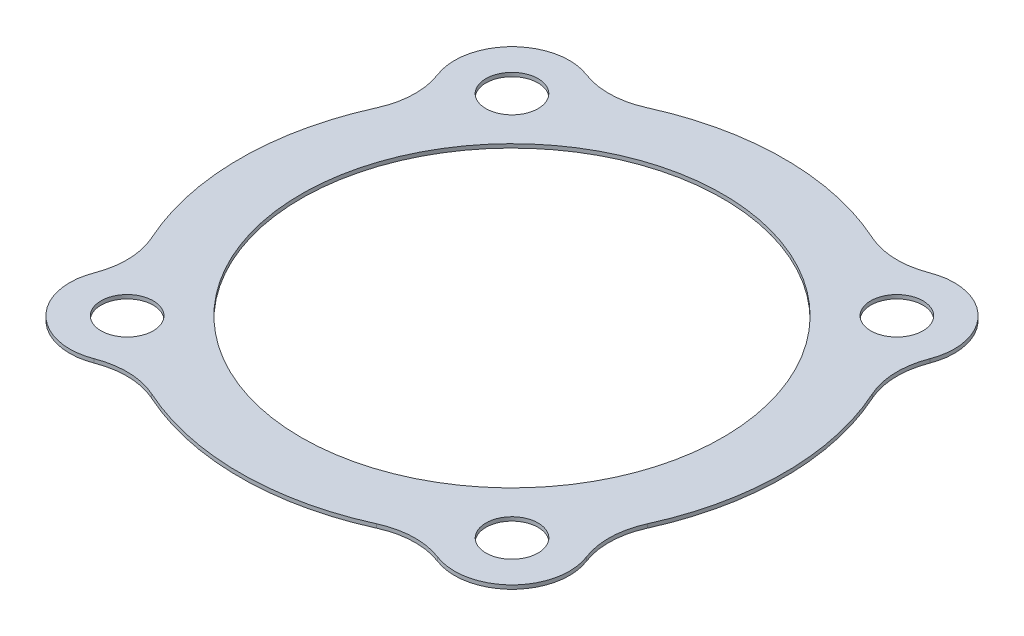
ISO-10303-21;
HEADER;
FILE_DESCRIPTION(('STEP AP214'),'2;1');
FILE_NAME('part.step','',(''),(''),'','','');
FILE_SCHEMA(('AUTOMOTIVE_DESIGN { 1 0 10303 214 1 1 1 1 }'));
ENDSEC;
DATA;
#1=APPLICATION_CONTEXT('core data for automotive mechanical design processes');
#2=APPLICATION_PROTOCOL_DEFINITION('international standard','automotive_design',2000,#1);
#3=PRODUCT_CONTEXT('',#1,'mechanical');
#4=PRODUCT('Part','Part','',(#3));
#5=PRODUCT_RELATED_PRODUCT_CATEGORY('part','',(#4));
#6=PRODUCT_DEFINITION_FORMATION('','',#4);
#7=PRODUCT_DEFINITION_CONTEXT('part definition',#1,'design');
#8=PRODUCT_DEFINITION('design','',#6,#7);
#9=PRODUCT_DEFINITION_SHAPE('','',#8);
#10=(LENGTH_UNIT() NAMED_UNIT(*) SI_UNIT(.MILLI.,.METRE.));
#11=(NAMED_UNIT(*) PLANE_ANGLE_UNIT() SI_UNIT($,.RADIAN.));
#12=(NAMED_UNIT(*) SI_UNIT($,.STERADIAN.) SOLID_ANGLE_UNIT());
#13=UNCERTAINTY_MEASURE_WITH_UNIT(LENGTH_MEASURE(1.E-05),#10,'distance_accuracy_value','');
#14=(GEOMETRIC_REPRESENTATION_CONTEXT(3) GLOBAL_UNCERTAINTY_ASSIGNED_CONTEXT((#13)) GLOBAL_UNIT_ASSIGNED_CONTEXT((#10,
#11,#12)) REPRESENTATION_CONTEXT('',''));
#15=CARTESIAN_POINT('',(0.,0.,0.));
#16=DIRECTION('',(0.,0.,1.));
#17=DIRECTION('',(1.,0.,0.));
#18=AXIS2_PLACEMENT_3D('',#15,#16,#17);
#19=CARTESIAN_POINT('',(0.,0.635,0.));
#20=DIRECTION('',(0.,-1.,0.));
#21=DIRECTION('',(0.,0.,-1.));
#22=AXIS2_PLACEMENT_3D('',#19,#20,#21);
#23=CYLINDRICAL_SURFACE('',#22,45.085);
#24=CARTESIAN_POINT('',(0.,0.,0.));
#25=DIRECTION('',(0.,1.,0.));
#26=DIRECTION('',(0.,0.,1.));
#27=AXIS2_PLACEMENT_3D('',#24,#25,#26);
#28=CIRCLE('',#27,45.085);
#29=CARTESIAN_POINT('',(41.0530952097482,0.,18.636002755402));
#30=VERTEX_POINT('',#29);
#31=CARTESIAN_POINT('',(41.0530952097478,0.,-18.6360027554029));
#32=VERTEX_POINT('',#31);
#33=EDGE_CURVE('E185',#30,#32,#28,.T.);
#34=ORIENTED_EDGE('',*,*,#33,.T.);
#35=DIRECTION('',(0.,-1.,0.));
#36=VECTOR('',#35,1.);
#37=CARTESIAN_POINT('',(41.0530952097478,0.635,-18.6360027554029));
#38=LINE('',#37,#36);
#39=CARTESIAN_POINT('',(41.0530952097478,0.635,-18.6360027554029));
#40=VERTEX_POINT('',#39);
#41=EDGE_CURVE('E220',#32,#40,#38,.F.);
#42=ORIENTED_EDGE('',*,*,#41,.T.);
#43=CARTESIAN_POINT('',(0.,0.635,0.));
#44=DIRECTION('',(0.,1.,0.));
#45=DIRECTION('',(0.,0.,1.));
#46=AXIS2_PLACEMENT_3D('',#43,#44,#45);
#47=CIRCLE('',#46,45.085);
#48=CARTESIAN_POINT('',(41.0530952097482,0.635,18.636002755402));
#49=VERTEX_POINT('',#48);
#50=EDGE_CURVE('E182',#49,#40,#47,.T.);
#51=ORIENTED_EDGE('',*,*,#50,.F.);
#52=DIRECTION('',(0.,-1.,0.));
#53=VECTOR('',#52,1.);
#54=CARTESIAN_POINT('',(41.0530952097482,0.635,18.636002755402));
#55=LINE('',#54,#53);
#56=EDGE_CURVE('E219',#49,#30,#55,.T.);
#57=ORIENTED_EDGE('',*,*,#56,.T.);
#58=EDGE_LOOP('',(#34,#42,#51,#57));
#59=FACE_BOUND('',#58,.T.);
#60=ADVANCED_FACE('F37',(#59),#23,.T.);
#61=CARTESIAN_POINT('',(-18.6360027554019,0.,41.0530952097482));
#62=VERTEX_POINT('',#61);
#63=CARTESIAN_POINT('',(18.6360027554024,0.,41.053095209748));
#64=VERTEX_POINT('',#63);
#65=EDGE_CURVE('E179',#62,#64,#28,.T.);
#66=ORIENTED_EDGE('',*,*,#65,.T.);
#67=DIRECTION('',(0.,-1.,0.));
#68=VECTOR('',#67,1.);
#69=CARTESIAN_POINT('',(18.6360027554024,0.635,41.053095209748));
#70=LINE('',#69,#68);
#71=CARTESIAN_POINT('',(18.6360027554024,0.635,41.053095209748));
#72=VERTEX_POINT('',#71);
#73=EDGE_CURVE('E234',#64,#72,#70,.F.);
#74=ORIENTED_EDGE('',*,*,#73,.T.);
#75=CARTESIAN_POINT('',(-18.6360027554019,0.635,41.0530952097482));
#76=VERTEX_POINT('',#75);
#77=EDGE_CURVE('E203',#76,#72,#47,.T.);
#78=ORIENTED_EDGE('',*,*,#77,.F.);
#79=DIRECTION('',(0.,-1.,0.));
#80=VECTOR('',#79,1.);
#81=CARTESIAN_POINT('',(-18.6360027554019,0.635,41.0530952097482));
#82=LINE('',#81,#80);
#83=EDGE_CURVE('E301',#76,#62,#82,.T.);
#84=ORIENTED_EDGE('',*,*,#83,.T.);
#85=EDGE_LOOP('',(#66,#74,#78,#84));
#86=FACE_BOUND('',#85,.T.);
#87=ADVANCED_FACE('F334',(#86),#23,.T.);
#88=CARTESIAN_POINT('',(-41.0530952097482,0.,-18.636002755402));
#89=VERTEX_POINT('',#88);
#90=CARTESIAN_POINT('',(-41.0530952097479,0.,18.6360027554026));
#91=VERTEX_POINT('',#90);
#92=EDGE_CURVE('E166',#89,#91,#28,.T.);
#93=ORIENTED_EDGE('',*,*,#92,.T.);
#94=DIRECTION('',(0.,-1.,0.));
#95=VECTOR('',#94,1.);
#96=CARTESIAN_POINT('',(-41.0530952097479,0.635,18.6360027554026));
#97=LINE('',#96,#95);
#98=CARTESIAN_POINT('',(-41.0530952097479,0.635,18.6360027554026));
#99=VERTEX_POINT('',#98);
#100=EDGE_CURVE('E308',#91,#99,#97,.F.);
#101=ORIENTED_EDGE('',*,*,#100,.T.);
#102=CARTESIAN_POINT('',(-41.0530952097482,0.635,-18.636002755402));
#103=VERTEX_POINT('',#102);
#104=EDGE_CURVE('E169',#103,#99,#47,.T.);
#105=ORIENTED_EDGE('',*,*,#104,.F.);
#106=DIRECTION('',(0.,-1.,0.));
#107=VECTOR('',#106,1.);
#108=CARTESIAN_POINT('',(-41.0530952097482,0.635,-18.636002755402));
#109=LINE('',#108,#107);
#110=EDGE_CURVE('E154',#103,#89,#109,.T.);
#111=ORIENTED_EDGE('',*,*,#110,.T.);
#112=EDGE_LOOP('',(#93,#101,#105,#111));
#113=FACE_BOUND('',#112,.T.);
#114=ADVANCED_FACE('F164',(#113),#23,.T.);
#115=CARTESIAN_POINT('',(18.6360027554016,0.635,-41.0530952097484));
#116=VERTEX_POINT('',#115);
#117=CARTESIAN_POINT('',(-18.6360027554024,0.635,-41.053095209748));
#118=VERTEX_POINT('',#117);
#119=EDGE_CURVE('E178',#116,#118,#47,.T.);
#120=ORIENTED_EDGE('',*,*,#119,.F.);
#121=DIRECTION('',(0.,-1.,0.));
#122=VECTOR('',#121,1.);
#123=CARTESIAN_POINT('',(18.6360027554016,0.635,-41.0530952097484));
#124=LINE('',#123,#122);
#125=CARTESIAN_POINT('',(18.6360027554016,0.,-41.0530952097484));
#126=VERTEX_POINT('',#125);
#127=EDGE_CURVE('E243',#116,#126,#124,.T.);
#128=ORIENTED_EDGE('',*,*,#127,.T.);
#129=CARTESIAN_POINT('',(-18.6360027554024,0.,-41.053095209748));
#130=VERTEX_POINT('',#129);
#131=EDGE_CURVE('E181',#126,#130,#28,.T.);
#132=ORIENTED_EDGE('',*,*,#131,.T.);
#133=DIRECTION('',(0.,-1.,0.));
#134=VECTOR('',#133,1.);
#135=CARTESIAN_POINT('',(-18.6360027554024,0.635,-41.053095209748));
#136=LINE('',#135,#134);
#137=EDGE_CURVE('E171',#130,#118,#136,.F.);
#138=ORIENTED_EDGE('',*,*,#137,.T.);
#139=EDGE_LOOP('',(#120,#128,#132,#138));
#140=FACE_BOUND('',#139,.T.);
#141=ADVANCED_FACE('F260',(#140),#23,.T.);
#142=CARTESIAN_POINT('',(0.,0.635,0.));
#143=DIRECTION('',(0.,1.,0.));
#144=DIRECTION('',(0.,0.,1.));
#145=AXIS2_PLACEMENT_3D('',#142,#143,#144);
#146=PLANE('',#145);
#147=CARTESIAN_POINT('',(-31.8799092297952,0.635,31.8799092297958));
#148=DIRECTION('',(0.,1.,0.));
#149=DIRECTION('',(1.,0.,0.));
#150=AXIS2_PLACEMENT_3D('',#147,#148,#149);
#151=CIRCLE('',#150,4.318);
#152=CARTESIAN_POINT('',(-27.5619092297952,0.635,31.8799092297958));
#153=VERTEX_POINT('',#152);
#154=EDGE_CURVE('E553',#153,#153,#151,.T.);
#155=ORIENTED_EDGE('',*,*,#154,.F.);
#156=EDGE_LOOP('',(#155));
#157=FACE_BOUND('',#156,.T.);
#158=CARTESIAN_POINT('',(31.8799092297957,0.635,31.8799092297953));
#159=DIRECTION('',(0.,1.,0.));
#160=DIRECTION('',(0.,0.,-1.));
#161=AXIS2_PLACEMENT_3D('',#158,#159,#160);
#162=CIRCLE('',#161,4.318);
#163=CARTESIAN_POINT('',(31.8799092297957,0.635,27.5619092297953));
#164=VERTEX_POINT('',#163);
#165=EDGE_CURVE('E558',#164,#164,#162,.T.);
#166=ORIENTED_EDGE('',*,*,#165,.F.);
#167=EDGE_LOOP('',(#166));
#168=FACE_BOUND('',#167,.T.);
#169=CARTESIAN_POINT('',(31.879909229795,0.635,-31.879909229796));
#170=DIRECTION('',(0.,1.,0.));
#171=DIRECTION('',(-1.,0.,0.));
#172=AXIS2_PLACEMENT_3D('',#169,#170,#171);
#173=CIRCLE('',#172,4.318);
#174=CARTESIAN_POINT('',(27.561909229795,0.635,-31.879909229796));
#175=VERTEX_POINT('',#174);
#176=EDGE_CURVE('E274',#175,#175,#173,.T.);
#177=ORIENTED_EDGE('',*,*,#176,.F.);
#178=EDGE_LOOP('',(#177));
#179=FACE_BOUND('',#178,.T.);
#180=CARTESIAN_POINT('',(31.8799092297957,0.635,31.8799092297953));
#181=DIRECTION('',(0.,1.,0.));
#182=DIRECTION('',(0.,0.,-1.));
#183=AXIS2_PLACEMENT_3D('',#180,#181,#182);
#184=CIRCLE('',#183,9.525);
#185=CARTESIAN_POINT('',(28.4537685583236,0.635,40.7673827233865));
#186=VERTEX_POINT('',#185);
#187=CARTESIAN_POINT('',(40.7673827233868,0.635,28.4537685583232));
#188=VERTEX_POINT('',#187);
#189=EDGE_CURVE('E267',#186,#188,#184,.T.);
#190=ORIENTED_EDGE('',*,*,#189,.T.);
#191=CARTESIAN_POINT('',(52.6173473815082,0.635,23.8855809963603));
#192=DIRECTION('',(0.,1.,0.));
#193=DIRECTION('',(0.,0.,1.));
#194=AXIS2_PLACEMENT_3D('',#191,#192,#193);
#195=CIRCLE('',#194,12.7);
#196=EDGE_CURVE('E215',#188,#49,#195,.F.);
#197=ORIENTED_EDGE('',*,*,#196,.T.);
#198=ORIENTED_EDGE('',*,*,#50,.T.);
#199=CARTESIAN_POINT('',(52.6173473815077,0.635,-23.8855809963614));
#200=DIRECTION('',(0.,1.,0.));
#201=DIRECTION('',(0.,0.,1.));
#202=AXIS2_PLACEMENT_3D('',#199,#200,#201);
#203=CIRCLE('',#202,12.7);
#204=CARTESIAN_POINT('',(40.7673827233862,0.635,-28.453768558324));
#205=VERTEX_POINT('',#204);
#206=EDGE_CURVE('E45',#40,#205,#203,.F.);
#207=ORIENTED_EDGE('',*,*,#206,.T.);
#208=CARTESIAN_POINT('',(31.879909229795,0.635,-31.879909229796));
#209=DIRECTION('',(0.,1.,0.));
#210=DIRECTION('',(-1.,0.,0.));
#211=AXIS2_PLACEMENT_3D('',#208,#209,#210);
#212=CIRCLE('',#211,9.525);
#213=CARTESIAN_POINT('',(28.4537685583228,0.635,-40.7673827233871));
#214=VERTEX_POINT('',#213);
#215=EDGE_CURVE('E256',#205,#214,#212,.T.);
#216=ORIENTED_EDGE('',*,*,#215,.T.);
#217=CARTESIAN_POINT('',(23.8855809963598,0.635,-52.6173473815085));
#218=DIRECTION('',(0.,1.,0.));
#219=DIRECTION('',(0.,0.,1.));
#220=AXIS2_PLACEMENT_3D('',#217,#218,#219);
#221=CIRCLE('',#220,12.7);
#222=EDGE_CURVE('E252',#214,#116,#221,.F.);
#223=ORIENTED_EDGE('',*,*,#222,.T.);
#224=ORIENTED_EDGE('',*,*,#119,.T.);
#225=CARTESIAN_POINT('',(-23.8855809963609,0.635,-52.617347381508));
#226=DIRECTION('',(0.,1.,0.));
#227=DIRECTION('',(0.,0.,1.));
#228=AXIS2_PLACEMENT_3D('',#225,#226,#227);
#229=CIRCLE('',#228,12.7);
#230=CARTESIAN_POINT('',(-28.4537685583236,0.635,-40.7673827233865));
#231=VERTEX_POINT('',#230);
#232=EDGE_CURVE('E293',#118,#231,#229,.F.);
#233=ORIENTED_EDGE('',*,*,#232,.T.);
#234=CARTESIAN_POINT('',(-31.8799092297957,0.635,-31.8799092297953));
#235=DIRECTION('',(0.,1.,0.));
#236=DIRECTION('',(0.,0.,1.));
#237=AXIS2_PLACEMENT_3D('',#234,#235,#236);
#238=CIRCLE('',#237,9.525);
#239=CARTESIAN_POINT('',(-40.7673827233868,0.635,-28.4537685583232));
#240=VERTEX_POINT('',#239);
#241=EDGE_CURVE('E201',#231,#240,#238,.T.);
#242=ORIENTED_EDGE('',*,*,#241,.T.);
#243=CARTESIAN_POINT('',(-52.6173473815082,0.635,-23.8855809963603));
#244=DIRECTION('',(0.,1.,0.));
#245=DIRECTION('',(0.,0.,1.));
#246=AXIS2_PLACEMENT_3D('',#243,#244,#245);
#247=CIRCLE('',#246,12.7);
#248=EDGE_CURVE('E159',#240,#103,#247,.F.);
#249=ORIENTED_EDGE('',*,*,#248,.T.);
#250=ORIENTED_EDGE('',*,*,#104,.T.);
#251=CARTESIAN_POINT('',(-52.6173473815079,0.635,23.8855809963611));
#252=DIRECTION('',(0.,1.,0.));
#253=DIRECTION('',(0.,0.,1.));
#254=AXIS2_PLACEMENT_3D('',#251,#252,#253);
#255=CIRCLE('',#254,12.7);
#256=CARTESIAN_POINT('',(-40.7673827233864,0.635,28.4537685583238));
#257=VERTEX_POINT('',#256);
#258=EDGE_CURVE('E229',#99,#257,#255,.F.);
#259=ORIENTED_EDGE('',*,*,#258,.T.);
#260=CARTESIAN_POINT('',(-31.8799092297952,0.635,31.8799092297958));
#261=DIRECTION('',(0.,1.,0.));
#262=DIRECTION('',(1.,0.,0.));
#263=AXIS2_PLACEMENT_3D('',#260,#261,#262);
#264=CIRCLE('',#263,9.525);
#265=CARTESIAN_POINT('',(-28.453768558323,0.635,40.7673827233869));
#266=VERTEX_POINT('',#265);
#267=EDGE_CURVE('E278',#257,#266,#264,.T.);
#268=ORIENTED_EDGE('',*,*,#267,.T.);
#269=CARTESIAN_POINT('',(-23.8855809963601,0.635,52.6173473815083));
#270=DIRECTION('',(0.,1.,0.));
#271=DIRECTION('',(0.,0.,1.));
#272=AXIS2_PLACEMENT_3D('',#269,#270,#271);
#273=CIRCLE('',#272,12.7);
#274=EDGE_CURVE('E312',#266,#76,#273,.F.);
#275=ORIENTED_EDGE('',*,*,#274,.T.);
#276=ORIENTED_EDGE('',*,*,#77,.T.);
#277=CARTESIAN_POINT('',(23.8855809963609,0.635,52.617347381508));
#278=DIRECTION('',(0.,1.,0.));
#279=DIRECTION('',(0.,0.,1.));
#280=AXIS2_PLACEMENT_3D('',#277,#278,#279);
#281=CIRCLE('',#280,12.7);
#282=EDGE_CURVE('E239',#72,#186,#281,.F.);
#283=ORIENTED_EDGE('',*,*,#282,.T.);
#284=EDGE_LOOP('',(#190,#197,#198,#207,#216,#223,#224,#233,#242,#249,#250,#259,#268,#275,#276,#283));
#285=FACE_BOUND('',#284,.T.);
#286=CARTESIAN_POINT('',(-31.8799092297957,0.635,-31.8799092297953));
#287=DIRECTION('',(0.,1.,0.));
#288=DIRECTION('',(0.,0.,1.));
#289=AXIS2_PLACEMENT_3D('',#286,#287,#288);
#290=CIRCLE('',#289,4.318);
#291=CARTESIAN_POINT('',(-31.8799092297957,0.635,-27.5619092297953));
#292=VERTEX_POINT('',#291);
#293=EDGE_CURVE('E283',#292,#292,#290,.T.);
#294=ORIENTED_EDGE('',*,*,#293,.F.);
#295=EDGE_LOOP('',(#294));
#296=FACE_BOUND('',#295,.T.);
#297=CARTESIAN_POINT('',(0.,0.635,0.));
#298=DIRECTION('',(0.,1.,0.));
#299=DIRECTION('',(0.,0.,1.));
#300=AXIS2_PLACEMENT_3D('',#297,#298,#299);
#301=CIRCLE('',#300,34.925);
#302=CARTESIAN_POINT('',(0.,0.635,34.925));
#303=VERTEX_POINT('',#302);
#304=EDGE_CURVE('E193',#303,#303,#301,.T.);
#305=ORIENTED_EDGE('',*,*,#304,.F.);
#306=EDGE_LOOP('',(#305));
#307=FACE_BOUND('',#306,.T.);
#308=ADVANCED_FACE('F210',(#157,#168,#179,#285,#296,#307),#146,.T.);
#309=CARTESIAN_POINT('',(0.,0.,0.));
#310=DIRECTION('',(0.,1.,0.));
#311=DIRECTION('',(0.,0.,1.));
#312=AXIS2_PLACEMENT_3D('',#309,#310,#311);
#313=PLANE('',#312);
#314=CARTESIAN_POINT('',(-31.8799092297952,0.,31.8799092297958));
#315=DIRECTION('',(0.,1.,0.));
#316=DIRECTION('',(1.,0.,0.));
#317=AXIS2_PLACEMENT_3D('',#314,#315,#316);
#318=CIRCLE('',#317,4.318);
#319=CARTESIAN_POINT('',(-27.5619092297952,0.,31.8799092297958));
#320=VERTEX_POINT('',#319);
#321=EDGE_CURVE('E271',#320,#320,#318,.T.);
#322=ORIENTED_EDGE('',*,*,#321,.T.);
#323=EDGE_LOOP('',(#322));
#324=FACE_BOUND('',#323,.T.);
#325=CARTESIAN_POINT('',(31.8799092297957,0.,31.8799092297953));
#326=DIRECTION('',(0.,1.,0.));
#327=DIRECTION('',(0.,0.,-1.));
#328=AXIS2_PLACEMENT_3D('',#325,#326,#327);
#329=CIRCLE('',#328,4.318);
#330=CARTESIAN_POINT('',(31.8799092297957,0.,27.5619092297953));
#331=VERTEX_POINT('',#330);
#332=EDGE_CURVE('E554',#331,#331,#329,.T.);
#333=ORIENTED_EDGE('',*,*,#332,.T.);
#334=EDGE_LOOP('',(#333));
#335=FACE_BOUND('',#334,.T.);
#336=CARTESIAN_POINT('',(31.879909229795,0.,-31.879909229796));
#337=DIRECTION('',(0.,1.,0.));
#338=DIRECTION('',(-1.,0.,0.));
#339=AXIS2_PLACEMENT_3D('',#336,#337,#338);
#340=CIRCLE('',#339,4.318);
#341=CARTESIAN_POINT('',(27.561909229795,0.,-31.879909229796));
#342=VERTEX_POINT('',#341);
#343=EDGE_CURVE('E562',#342,#342,#340,.T.);
#344=ORIENTED_EDGE('',*,*,#343,.T.);
#345=EDGE_LOOP('',(#344));
#346=FACE_BOUND('',#345,.T.);
#347=CARTESIAN_POINT('',(-31.8799092297957,0.,-31.8799092297953));
#348=DIRECTION('',(0.,1.,0.));
#349=DIRECTION('',(0.,0.,1.));
#350=AXIS2_PLACEMENT_3D('',#347,#348,#349);
#351=CIRCLE('',#350,4.318);
#352=CARTESIAN_POINT('',(-31.8799092297957,0.,-27.5619092297953));
#353=VERTEX_POINT('',#352);
#354=EDGE_CURVE('E286',#353,#353,#351,.T.);
#355=ORIENTED_EDGE('',*,*,#354,.T.);
#356=EDGE_LOOP('',(#355));
#357=FACE_BOUND('',#356,.T.);
#358=CARTESIAN_POINT('',(0.,0.,0.));
#359=DIRECTION('',(0.,1.,0.));
#360=DIRECTION('',(0.,0.,1.));
#361=AXIS2_PLACEMENT_3D('',#358,#359,#360);
#362=CIRCLE('',#361,34.925);
#363=CARTESIAN_POINT('',(0.,0.,34.925));
#364=VERTEX_POINT('',#363);
#365=EDGE_CURVE('E187',#364,#364,#362,.T.);
#366=ORIENTED_EDGE('',*,*,#365,.T.);
#367=EDGE_LOOP('',(#366));
#368=FACE_BOUND('',#367,.T.);
#369=ORIENTED_EDGE('',*,*,#131,.F.);
#370=CARTESIAN_POINT('',(23.8855809963598,0.,-52.6173473815085));
#371=DIRECTION('',(0.,1.,0.));
#372=DIRECTION('',(0.,0.,1.));
#373=AXIS2_PLACEMENT_3D('',#370,#371,#372);
#374=CIRCLE('',#373,12.7);
#375=CARTESIAN_POINT('',(28.4537685583228,0.,-40.7673827233871));
#376=VERTEX_POINT('',#375);
#377=EDGE_CURVE('E250',#126,#376,#374,.T.);
#378=ORIENTED_EDGE('',*,*,#377,.T.);
#379=CARTESIAN_POINT('',(31.879909229795,0.,-31.879909229796));
#380=DIRECTION('',(0.,1.,0.));
#381=DIRECTION('',(-1.,0.,0.));
#382=AXIS2_PLACEMENT_3D('',#379,#380,#381);
#383=CIRCLE('',#382,9.525);
#384=CARTESIAN_POINT('',(40.7673827233862,0.,-28.453768558324));
#385=VERTEX_POINT('',#384);
#386=EDGE_CURVE('E264',#385,#376,#383,.T.);
#387=ORIENTED_EDGE('',*,*,#386,.F.);
#388=CARTESIAN_POINT('',(52.6173473815077,0.,-23.8855809963614));
#389=DIRECTION('',(0.,1.,0.));
#390=DIRECTION('',(0.,0.,1.));
#391=AXIS2_PLACEMENT_3D('',#388,#389,#390);
#392=CIRCLE('',#391,12.7);
#393=EDGE_CURVE('E11',#385,#32,#392,.T.);
#394=ORIENTED_EDGE('',*,*,#393,.T.);
#395=ORIENTED_EDGE('',*,*,#33,.F.);
#396=CARTESIAN_POINT('',(52.6173473815082,0.,23.8855809963603));
#397=DIRECTION('',(0.,1.,0.));
#398=DIRECTION('',(0.,0.,1.));
#399=AXIS2_PLACEMENT_3D('',#396,#397,#398);
#400=CIRCLE('',#399,12.7);
#401=CARTESIAN_POINT('',(40.7673827233868,0.,28.4537685583232));
#402=VERTEX_POINT('',#401);
#403=EDGE_CURVE('E224',#30,#402,#400,.T.);
#404=ORIENTED_EDGE('',*,*,#403,.T.);
#405=CARTESIAN_POINT('',(31.8799092297957,0.,31.8799092297953));
#406=DIRECTION('',(0.,1.,0.));
#407=DIRECTION('',(0.,0.,-1.));
#408=AXIS2_PLACEMENT_3D('',#405,#406,#407);
#409=CIRCLE('',#408,9.525);
#410=CARTESIAN_POINT('',(28.4537685583236,0.,40.7673827233865));
#411=VERTEX_POINT('',#410);
#412=EDGE_CURVE('E269',#411,#402,#409,.T.);
#413=ORIENTED_EDGE('',*,*,#412,.F.);
#414=CARTESIAN_POINT('',(23.8855809963609,0.,52.617347381508));
#415=DIRECTION('',(0.,1.,0.));
#416=DIRECTION('',(0.,0.,1.));
#417=AXIS2_PLACEMENT_3D('',#414,#415,#416);
#418=CIRCLE('',#417,12.7);
#419=EDGE_CURVE('E241',#411,#64,#418,.T.);
#420=ORIENTED_EDGE('',*,*,#419,.T.);
#421=ORIENTED_EDGE('',*,*,#65,.F.);
#422=CARTESIAN_POINT('',(-23.8855809963601,0.,52.6173473815083));
#423=DIRECTION('',(0.,1.,0.));
#424=DIRECTION('',(0.,0.,1.));
#425=AXIS2_PLACEMENT_3D('',#422,#423,#424);
#426=CIRCLE('',#425,12.7);
#427=CARTESIAN_POINT('',(-28.453768558323,0.,40.7673827233869));
#428=VERTEX_POINT('',#427);
#429=EDGE_CURVE('E310',#62,#428,#426,.T.);
#430=ORIENTED_EDGE('',*,*,#429,.T.);
#431=CARTESIAN_POINT('',(-31.8799092297952,0.,31.8799092297958));
#432=DIRECTION('',(0.,1.,0.));
#433=DIRECTION('',(1.,0.,0.));
#434=AXIS2_PLACEMENT_3D('',#431,#432,#433);
#435=CIRCLE('',#434,9.525);
#436=CARTESIAN_POINT('',(-40.7673827233864,0.,28.4537685583238));
#437=VERTEX_POINT('',#436);
#438=EDGE_CURVE('E280',#437,#428,#435,.T.);
#439=ORIENTED_EDGE('',*,*,#438,.F.);
#440=CARTESIAN_POINT('',(-52.6173473815079,0.,23.8855809963611));
#441=DIRECTION('',(0.,1.,0.));
#442=DIRECTION('',(0.,0.,1.));
#443=AXIS2_PLACEMENT_3D('',#440,#441,#442);
#444=CIRCLE('',#443,12.7);
#445=EDGE_CURVE('E177',#437,#91,#444,.T.);
#446=ORIENTED_EDGE('',*,*,#445,.T.);
#447=ORIENTED_EDGE('',*,*,#92,.F.);
#448=CARTESIAN_POINT('',(-52.6173473815082,0.,-23.8855809963603));
#449=DIRECTION('',(0.,1.,0.));
#450=DIRECTION('',(0.,0.,1.));
#451=AXIS2_PLACEMENT_3D('',#448,#449,#450);
#452=CIRCLE('',#451,12.7);
#453=CARTESIAN_POINT('',(-40.7673827233868,0.,-28.4537685583232));
#454=VERTEX_POINT('',#453);
#455=EDGE_CURVE('E150',#89,#454,#452,.T.);
#456=ORIENTED_EDGE('',*,*,#455,.T.);
#457=CARTESIAN_POINT('',(-31.8799092297957,0.,-31.8799092297953));
#458=DIRECTION('',(0.,1.,0.));
#459=DIRECTION('',(0.,0.,1.));
#460=AXIS2_PLACEMENT_3D('',#457,#458,#459);
#461=CIRCLE('',#460,9.525);
#462=CARTESIAN_POINT('',(-28.4537685583236,0.,-40.7673827233865));
#463=VERTEX_POINT('',#462);
#464=EDGE_CURVE('E198',#463,#454,#461,.T.);
#465=ORIENTED_EDGE('',*,*,#464,.F.);
#466=CARTESIAN_POINT('',(-23.8855809963609,0.,-52.617347381508));
#467=DIRECTION('',(0.,1.,0.));
#468=DIRECTION('',(0.,0.,1.));
#469=AXIS2_PLACEMENT_3D('',#466,#467,#468);
#470=CIRCLE('',#469,12.7);
#471=EDGE_CURVE('E296',#463,#130,#470,.T.);
#472=ORIENTED_EDGE('',*,*,#471,.T.);
#473=EDGE_LOOP('',(#369,#378,#387,#394,#395,#404,#413,#420,#421,#430,#439,#446,#447,#456,#465,#472));
#474=FACE_BOUND('',#473,.T.);
#475=ADVANCED_FACE('F174',(#324,#335,#346,#357,#368,#474),#313,.F.);
#476=CARTESIAN_POINT('',(0.,0.,0.));
#477=DIRECTION('',(0.,1.,0.));
#478=DIRECTION('',(0.,0.,1.));
#479=AXIS2_PLACEMENT_3D('',#476,#477,#478);
#480=CYLINDRICAL_SURFACE('',#479,34.925);
#481=ORIENTED_EDGE('',*,*,#365,.F.);
#482=EDGE_LOOP('',(#481));
#483=FACE_BOUND('',#482,.T.);
#484=ORIENTED_EDGE('',*,*,#304,.T.);
#485=EDGE_LOOP('',(#484));
#486=FACE_BOUND('',#485,.T.);
#487=ADVANCED_FACE('F391',(#483,#486),#480,.F.);
#488=CARTESIAN_POINT('',(-31.8799092297957,0.,-31.8799092297953));
#489=DIRECTION('',(0.,1.,0.));
#490=DIRECTION('',(0.,0.,1.));
#491=AXIS2_PLACEMENT_3D('',#488,#489,#490);
#492=CYLINDRICAL_SURFACE('',#491,9.525);
#493=ORIENTED_EDGE('',*,*,#464,.T.);
#494=DIRECTION('',(0.,1.,0.));
#495=VECTOR('',#494,1.);
#496=CARTESIAN_POINT('',(-40.7673827233868,0.,-28.4537685583232));
#497=LINE('',#496,#495);
#498=EDGE_CURVE('E155',#454,#240,#497,.T.);
#499=ORIENTED_EDGE('',*,*,#498,.T.);
#500=ORIENTED_EDGE('',*,*,#241,.F.);
#501=DIRECTION('',(0.,1.,0.));
#502=VECTOR('',#501,1.);
#503=CARTESIAN_POINT('',(-28.4537685583236,0.,-40.7673827233865));
#504=LINE('',#503,#502);
#505=EDGE_CURVE('E170',#231,#463,#504,.F.);
#506=ORIENTED_EDGE('',*,*,#505,.T.);
#507=EDGE_LOOP('',(#493,#499,#500,#506));
#508=FACE_BOUND('',#507,.T.);
#509=ADVANCED_FACE('F386',(#508),#492,.T.);
#510=CARTESIAN_POINT('',(-31.8799092297957,0.,-31.8799092297953));
#511=DIRECTION('',(0.,1.,0.));
#512=DIRECTION('',(0.,0.,1.));
#513=AXIS2_PLACEMENT_3D('',#510,#511,#512);
#514=CYLINDRICAL_SURFACE('',#513,4.318);
#515=ORIENTED_EDGE('',*,*,#354,.F.);
#516=EDGE_LOOP('',(#515));
#517=FACE_BOUND('',#516,.T.);
#518=ORIENTED_EDGE('',*,*,#293,.T.);
#519=EDGE_LOOP('',(#518));
#520=FACE_BOUND('',#519,.T.);
#521=ADVANCED_FACE('F380',(#517,#520),#514,.F.);
#522=CARTESIAN_POINT('',(-52.6173473815082,0.,-23.8855809963603));
#523=DIRECTION('',(0.,1.,0.));
#524=DIRECTION('',(0.,0.,1.));
#525=AXIS2_PLACEMENT_3D('',#522,#523,#524);
#526=CYLINDRICAL_SURFACE('',#525,12.7);
#527=ORIENTED_EDGE('',*,*,#248,.F.);
#528=ORIENTED_EDGE('',*,*,#498,.F.);
#529=ORIENTED_EDGE('',*,*,#455,.F.);
#530=ORIENTED_EDGE('',*,*,#110,.F.);
#531=EDGE_LOOP('',(#527,#528,#529,#530));
#532=FACE_BOUND('',#531,.T.);
#533=ADVANCED_FACE('F153',(#532),#526,.F.);
#534=CARTESIAN_POINT('',(-23.8855809963609,0.,-52.617347381508));
#535=DIRECTION('',(0.,-1.,0.));
#536=DIRECTION('',(0.,0.,-1.));
#537=AXIS2_PLACEMENT_3D('',#534,#535,#536);
#538=CYLINDRICAL_SURFACE('',#537,12.7);
#539=ORIENTED_EDGE('',*,*,#471,.F.);
#540=ORIENTED_EDGE('',*,*,#505,.F.);
#541=ORIENTED_EDGE('',*,*,#232,.F.);
#542=ORIENTED_EDGE('',*,*,#137,.F.);
#543=EDGE_LOOP('',(#539,#540,#541,#542));
#544=FACE_BOUND('',#543,.T.);
#545=ADVANCED_FACE('F365',(#544),#538,.F.);
#546=CARTESIAN_POINT('',(-31.8799092297952,0.,31.8799092297958));
#547=DIRECTION('',(0.,1.,0.));
#548=DIRECTION('',(0.,0.,1.));
#549=AXIS2_PLACEMENT_3D('',#546,#547,#548);
#550=CYLINDRICAL_SURFACE('',#549,9.525);
#551=ORIENTED_EDGE('',*,*,#438,.T.);
#552=DIRECTION('',(0.,1.,0.));
#553=VECTOR('',#552,1.);
#554=CARTESIAN_POINT('',(-28.453768558323,0.,40.7673827233869));
#555=LINE('',#554,#553);
#556=EDGE_CURVE('E306',#428,#266,#555,.T.);
#557=ORIENTED_EDGE('',*,*,#556,.T.);
#558=ORIENTED_EDGE('',*,*,#267,.F.);
#559=DIRECTION('',(0.,1.,0.));
#560=VECTOR('',#559,1.);
#561=CARTESIAN_POINT('',(-40.7673827233864,0.,28.4537685583238));
#562=LINE('',#561,#560);
#563=EDGE_CURVE('E304',#257,#437,#562,.F.);
#564=ORIENTED_EDGE('',*,*,#563,.T.);
#565=EDGE_LOOP('',(#551,#557,#558,#564));
#566=FACE_BOUND('',#565,.T.);
#567=ADVANCED_FACE('F318',(#566),#550,.T.);
#568=CARTESIAN_POINT('',(31.8799092297957,0.,31.8799092297953));
#569=DIRECTION('',(0.,1.,0.));
#570=DIRECTION('',(0.,0.,1.));
#571=AXIS2_PLACEMENT_3D('',#568,#569,#570);
#572=CYLINDRICAL_SURFACE('',#571,9.525);
#573=ORIENTED_EDGE('',*,*,#412,.T.);
#574=DIRECTION('',(0.,1.,0.));
#575=VECTOR('',#574,1.);
#576=CARTESIAN_POINT('',(40.7673827233868,0.,28.4537685583232));
#577=LINE('',#576,#575);
#578=EDGE_CURVE('E227',#402,#188,#577,.T.);
#579=ORIENTED_EDGE('',*,*,#578,.T.);
#580=ORIENTED_EDGE('',*,*,#189,.F.);
#581=DIRECTION('',(0.,1.,0.));
#582=VECTOR('',#581,1.);
#583=CARTESIAN_POINT('',(28.4537685583236,0.,40.7673827233865));
#584=LINE('',#583,#582);
#585=EDGE_CURVE('E225',#186,#411,#584,.F.);
#586=ORIENTED_EDGE('',*,*,#585,.T.);
#587=EDGE_LOOP('',(#573,#579,#580,#586));
#588=FACE_BOUND('',#587,.T.);
#589=ADVANCED_FACE('F453',(#588),#572,.T.);
#590=CARTESIAN_POINT('',(31.879909229795,0.,-31.879909229796));
#591=DIRECTION('',(0.,1.,0.));
#592=DIRECTION('',(0.,0.,1.));
#593=AXIS2_PLACEMENT_3D('',#590,#591,#592);
#594=CYLINDRICAL_SURFACE('',#593,9.525);
#595=ORIENTED_EDGE('',*,*,#386,.T.);
#596=DIRECTION('',(0.,1.,0.));
#597=VECTOR('',#596,1.);
#598=CARTESIAN_POINT('',(28.4537685583228,0.,-40.7673827233871));
#599=LINE('',#598,#597);
#600=EDGE_CURVE('E247',#376,#214,#599,.T.);
#601=ORIENTED_EDGE('',*,*,#600,.T.);
#602=ORIENTED_EDGE('',*,*,#215,.F.);
#603=DIRECTION('',(0.,1.,0.));
#604=VECTOR('',#603,1.);
#605=CARTESIAN_POINT('',(40.7673827233862,0.,-28.453768558324));
#606=LINE('',#605,#604);
#607=EDGE_CURVE('E245',#205,#385,#606,.F.);
#608=ORIENTED_EDGE('',*,*,#607,.T.);
#609=EDGE_LOOP('',(#595,#601,#602,#608));
#610=FACE_BOUND('',#609,.T.);
#611=ADVANCED_FACE('F266',(#610),#594,.T.);
#612=CARTESIAN_POINT('',(31.879909229795,0.,-31.879909229796));
#613=DIRECTION('',(0.,1.,0.));
#614=DIRECTION('',(0.,0.,1.));
#615=AXIS2_PLACEMENT_3D('',#612,#613,#614);
#616=CYLINDRICAL_SURFACE('',#615,4.318);
#617=ORIENTED_EDGE('',*,*,#343,.F.);
#618=EDGE_LOOP('',(#617));
#619=FACE_BOUND('',#618,.T.);
#620=ORIENTED_EDGE('',*,*,#176,.T.);
#621=EDGE_LOOP('',(#620));
#622=FACE_BOUND('',#621,.T.);
#623=ADVANCED_FACE('F469',(#619,#622),#616,.F.);
#624=CARTESIAN_POINT('',(31.8799092297957,0.,31.8799092297953));
#625=DIRECTION('',(0.,1.,0.));
#626=DIRECTION('',(0.,0.,1.));
#627=AXIS2_PLACEMENT_3D('',#624,#625,#626);
#628=CYLINDRICAL_SURFACE('',#627,4.318);
#629=ORIENTED_EDGE('',*,*,#332,.F.);
#630=EDGE_LOOP('',(#629));
#631=FACE_BOUND('',#630,.T.);
#632=ORIENTED_EDGE('',*,*,#165,.T.);
#633=EDGE_LOOP('',(#632));
#634=FACE_BOUND('',#633,.T.);
#635=ADVANCED_FACE('F477',(#631,#634),#628,.F.);
#636=CARTESIAN_POINT('',(-31.8799092297952,0.,31.8799092297958));
#637=DIRECTION('',(0.,1.,0.));
#638=DIRECTION('',(0.,0.,1.));
#639=AXIS2_PLACEMENT_3D('',#636,#637,#638);
#640=CYLINDRICAL_SURFACE('',#639,4.318);
#641=ORIENTED_EDGE('',*,*,#321,.F.);
#642=EDGE_LOOP('',(#641));
#643=FACE_BOUND('',#642,.T.);
#644=ORIENTED_EDGE('',*,*,#154,.T.);
#645=EDGE_LOOP('',(#644));
#646=FACE_BOUND('',#645,.T.);
#647=ADVANCED_FACE('F330',(#643,#646),#640,.F.);
#648=CARTESIAN_POINT('',(-23.8855809963601,0.,52.6173473815083));
#649=DIRECTION('',(0.,1.,0.));
#650=DIRECTION('',(0.,0.,1.));
#651=AXIS2_PLACEMENT_3D('',#648,#649,#650);
#652=CYLINDRICAL_SURFACE('',#651,12.7);
#653=ORIENTED_EDGE('',*,*,#274,.F.);
#654=ORIENTED_EDGE('',*,*,#556,.F.);
#655=ORIENTED_EDGE('',*,*,#429,.F.);
#656=ORIENTED_EDGE('',*,*,#83,.F.);
#657=EDGE_LOOP('',(#653,#654,#655,#656));
#658=FACE_BOUND('',#657,.T.);
#659=ADVANCED_FACE('F322',(#658),#652,.F.);
#660=CARTESIAN_POINT('',(-52.6173473815079,0.,23.8855809963611));
#661=DIRECTION('',(0.,-1.,0.));
#662=DIRECTION('',(0.,0.,-1.));
#663=AXIS2_PLACEMENT_3D('',#660,#661,#662);
#664=CYLINDRICAL_SURFACE('',#663,12.7);
#665=ORIENTED_EDGE('',*,*,#445,.F.);
#666=ORIENTED_EDGE('',*,*,#563,.F.);
#667=ORIENTED_EDGE('',*,*,#258,.F.);
#668=ORIENTED_EDGE('',*,*,#100,.F.);
#669=EDGE_LOOP('',(#665,#666,#667,#668));
#670=FACE_BOUND('',#669,.T.);
#671=ADVANCED_FACE('F320',(#670),#664,.F.);
#672=CARTESIAN_POINT('',(52.6173473815082,0.,23.8855809963603));
#673=DIRECTION('',(0.,1.,0.));
#674=DIRECTION('',(0.,0.,1.));
#675=AXIS2_PLACEMENT_3D('',#672,#673,#674);
#676=CYLINDRICAL_SURFACE('',#675,12.7);
#677=ORIENTED_EDGE('',*,*,#196,.F.);
#678=ORIENTED_EDGE('',*,*,#578,.F.);
#679=ORIENTED_EDGE('',*,*,#403,.F.);
#680=ORIENTED_EDGE('',*,*,#56,.F.);
#681=EDGE_LOOP('',(#677,#678,#679,#680));
#682=FACE_BOUND('',#681,.T.);
#683=ADVANCED_FACE('F222',(#682),#676,.F.);
#684=CARTESIAN_POINT('',(23.8855809963609,0.,52.617347381508));
#685=DIRECTION('',(0.,-1.,0.));
#686=DIRECTION('',(0.,0.,-1.));
#687=AXIS2_PLACEMENT_3D('',#684,#685,#686);
#688=CYLINDRICAL_SURFACE('',#687,12.7);
#689=ORIENTED_EDGE('',*,*,#419,.F.);
#690=ORIENTED_EDGE('',*,*,#585,.F.);
#691=ORIENTED_EDGE('',*,*,#282,.F.);
#692=ORIENTED_EDGE('',*,*,#73,.F.);
#693=EDGE_LOOP('',(#689,#690,#691,#692));
#694=FACE_BOUND('',#693,.T.);
#695=ADVANCED_FACE('F328',(#694),#688,.F.);
#696=CARTESIAN_POINT('',(23.8855809963598,0.,-52.6173473815085));
#697=DIRECTION('',(0.,1.,0.));
#698=DIRECTION('',(0.,0.,1.));
#699=AXIS2_PLACEMENT_3D('',#696,#697,#698);
#700=CYLINDRICAL_SURFACE('',#699,12.7);
#701=ORIENTED_EDGE('',*,*,#222,.F.);
#702=ORIENTED_EDGE('',*,*,#600,.F.);
#703=ORIENTED_EDGE('',*,*,#377,.F.);
#704=ORIENTED_EDGE('',*,*,#127,.F.);
#705=EDGE_LOOP('',(#701,#702,#703,#704));
#706=FACE_BOUND('',#705,.T.);
#707=ADVANCED_FACE('F262',(#706),#700,.F.);
#708=CARTESIAN_POINT('',(52.6173473815077,0.,-23.8855809963614));
#709=DIRECTION('',(0.,-1.,0.));
#710=DIRECTION('',(0.,0.,-1.));
#711=AXIS2_PLACEMENT_3D('',#708,#709,#710);
#712=CYLINDRICAL_SURFACE('',#711,12.7);
#713=ORIENTED_EDGE('',*,*,#393,.F.);
#714=ORIENTED_EDGE('',*,*,#607,.F.);
#715=ORIENTED_EDGE('',*,*,#206,.F.);
#716=ORIENTED_EDGE('',*,*,#41,.F.);
#717=EDGE_LOOP('',(#713,#714,#715,#716));
#718=FACE_BOUND('',#717,.T.);
#719=ADVANCED_FACE('F39',(#718),#712,.F.);
#720=CLOSED_SHELL('',(#60,#87,#114,#141,#308,#475,#487,#509,#521,#533,#545,#567,#589,#611,#623,
#635,#647,#659,#671,#683,#695,#707,#719));
#721=MANIFOLD_SOLID_BREP('B2',#720);
#722=ADVANCED_BREP_SHAPE_REPRESENTATION('',(#18,#721),#14);
#723=SHAPE_DEFINITION_REPRESENTATION(#9,#722);
ENDSEC;
END-ISO-10303-21;
